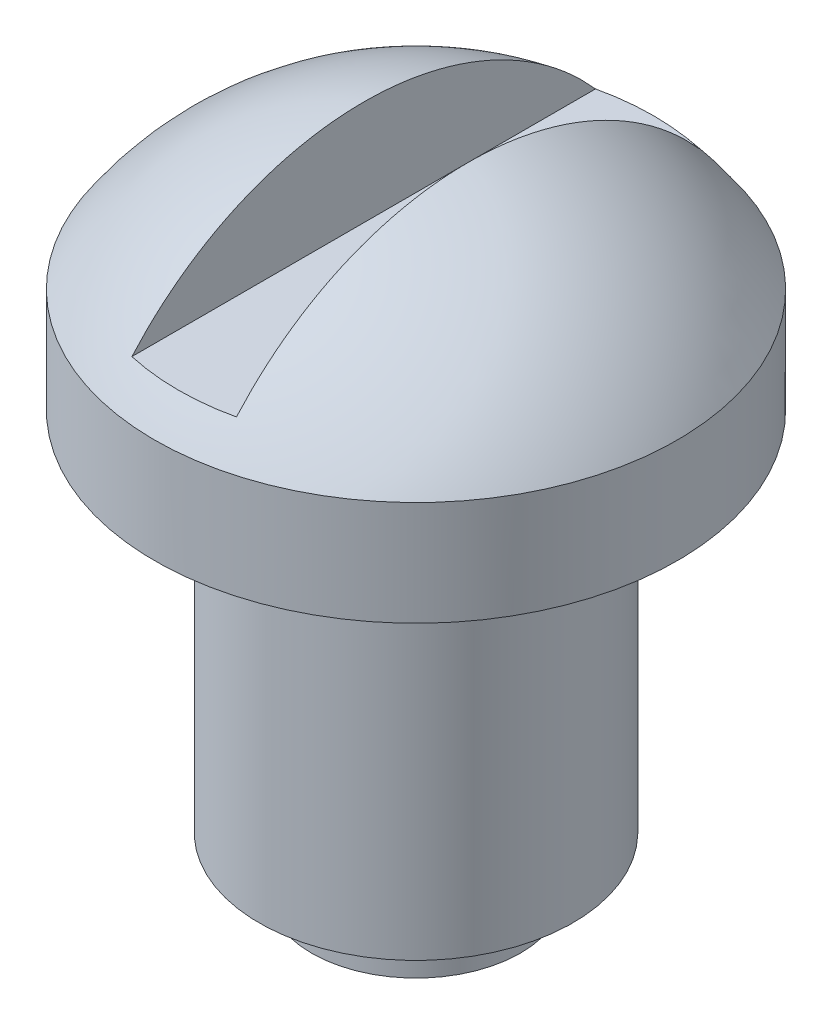
ISO-10303-21;
HEADER;
FILE_DESCRIPTION(('STEP AP214'),'2;1');
FILE_NAME('part.step','',(''),(''),'','','');
FILE_SCHEMA(('AUTOMOTIVE_DESIGN { 1 0 10303 214 1 1 1 1 }'));
ENDSEC;
DATA;
#1=APPLICATION_CONTEXT('core data for automotive mechanical design processes');
#2=APPLICATION_PROTOCOL_DEFINITION('international standard','automotive_design',2000,#1);
#3=PRODUCT_CONTEXT('',#1,'mechanical');
#4=PRODUCT('Part','Part','',(#3));
#5=PRODUCT_RELATED_PRODUCT_CATEGORY('part','',(#4));
#6=PRODUCT_DEFINITION_FORMATION('','',#4);
#7=PRODUCT_DEFINITION_CONTEXT('part definition',#1,'design');
#8=PRODUCT_DEFINITION('design','',#6,#7);
#9=PRODUCT_DEFINITION_SHAPE('','',#8);
#10=(LENGTH_UNIT() NAMED_UNIT(*) SI_UNIT(.MILLI.,.METRE.));
#11=(NAMED_UNIT(*) PLANE_ANGLE_UNIT() SI_UNIT($,.RADIAN.));
#12=(NAMED_UNIT(*) SI_UNIT($,.STERADIAN.) SOLID_ANGLE_UNIT());
#13=UNCERTAINTY_MEASURE_WITH_UNIT(LENGTH_MEASURE(1.E-05),#10,'distance_accuracy_value','');
#14=(GEOMETRIC_REPRESENTATION_CONTEXT(3) GLOBAL_UNCERTAINTY_ASSIGNED_CONTEXT((#13)) GLOBAL_UNIT_ASSIGNED_CONTEXT((#10,
#11,#12)) REPRESENTATION_CONTEXT('',''));
#15=CARTESIAN_POINT('',(0.,0.,0.));
#16=DIRECTION('',(0.,0.,1.));
#17=DIRECTION('',(1.,0.,0.));
#18=AXIS2_PLACEMENT_3D('',#15,#16,#17);
#19=CARTESIAN_POINT('',(0.,0.,0.));
#20=DIRECTION('',(0.,-1.,0.));
#21=DIRECTION('',(0.,0.,-0.999999999999978));
#22=AXIS2_PLACEMENT_3D('',#19,#20,#21);
#23=PLANE('',#22);
#24=CARTESIAN_POINT('',(0.,0.,0.));
#25=DIRECTION('',(0.,-1.,0.));
#26=DIRECTION('',(0.,0.,-0.999999999999978));
#27=AXIS2_PLACEMENT_3D('',#24,#25,#26);
#28=CIRCLE('',#27,2.);
#29=CARTESIAN_POINT('',(0.,0.,-1.99999999999996));
#30=VERTEX_POINT('',#29);
#31=EDGE_CURVE('E72',#30,#30,#28,.T.);
#32=ORIENTED_EDGE('',*,*,#31,.T.);
#33=EDGE_LOOP('',(#32));
#34=FACE_BOUND('',#33,.T.);
#35=ADVANCED_FACE('F42',(#34),#23,.T.);
#36=CARTESIAN_POINT('',(1.11022302462516E-13,8.00000000000001,0.));
#37=DIRECTION('',(0.,-1.,0.));
#38=DIRECTION('',(0.,0.,-0.999999999999978));
#39=AXIS2_PLACEMENT_3D('',#36,#37,#38);
#40=CYLINDRICAL_SURFACE('',#39,2.);
#41=CARTESIAN_POINT('',(0.,1.,0.));
#42=DIRECTION('',(0.,-1.,0.));
#43=DIRECTION('',(0.,0.,-0.999999999999978));
#44=AXIS2_PLACEMENT_3D('',#41,#42,#43);
#45=CIRCLE('',#44,2.);
#46=CARTESIAN_POINT('',(0.,1.,-1.99999999999998));
#47=VERTEX_POINT('',#46);
#48=EDGE_CURVE('E90',#47,#47,#45,.T.);
#49=ORIENTED_EDGE('',*,*,#48,.T.);
#50=EDGE_LOOP('',(#49));
#51=FACE_BOUND('',#50,.T.);
#52=ORIENTED_EDGE('',*,*,#31,.F.);
#53=EDGE_LOOP('',(#52));
#54=FACE_BOUND('',#53,.T.);
#55=ADVANCED_FACE('F124',(#51,#54),#40,.T.);
#56=CARTESIAN_POINT('',(0.,1.,0.));
#57=DIRECTION('',(0.,-1.,0.));
#58=DIRECTION('',(0.,0.,-0.999999999999978));
#59=AXIS2_PLACEMENT_3D('',#56,#57,#58);
#60=PLANE('',#59);
#61=CARTESIAN_POINT('',(0.,1.,0.));
#62=DIRECTION('',(0.,-1.,0.));
#63=DIRECTION('',(0.,0.,-0.999999999999978));
#64=AXIS2_PLACEMENT_3D('',#61,#62,#63);
#65=CIRCLE('',#64,3.);
#66=CARTESIAN_POINT('',(0.,1.,-2.99999999999995));
#67=VERTEX_POINT('',#66);
#68=EDGE_CURVE('E94',#67,#67,#65,.T.);
#69=ORIENTED_EDGE('',*,*,#68,.T.);
#70=EDGE_LOOP('',(#69));
#71=FACE_BOUND('',#70,.T.);
#72=ORIENTED_EDGE('',*,*,#48,.F.);
#73=EDGE_LOOP('',(#72));
#74=FACE_BOUND('',#73,.T.);
#75=ADVANCED_FACE('F129',(#71,#74),#60,.T.);
#76=CARTESIAN_POINT('',(1.11022302462516E-13,8.00000000000001,0.));
#77=DIRECTION('',(0.,-1.,0.));
#78=DIRECTION('',(0.,0.,-0.999999999999978));
#79=AXIS2_PLACEMENT_3D('',#76,#77,#78);
#80=CYLINDRICAL_SURFACE('',#79,3.);
#81=CARTESIAN_POINT('',(1.11022302462516E-13,8.00000000000001,0.));
#82=DIRECTION('',(0.,-1.,0.));
#83=DIRECTION('',(0.,0.,-0.999999999999978));
#84=AXIS2_PLACEMENT_3D('',#81,#82,#83);
#85=CIRCLE('',#84,3.);
#86=CARTESIAN_POINT('',(1.11022302462516E-13,8.00000000000001,-2.99999999999993));
#87=VERTEX_POINT('',#86);
#88=EDGE_CURVE('E98',#87,#87,#85,.T.);
#89=ORIENTED_EDGE('',*,*,#88,.T.);
#90=EDGE_LOOP('',(#89));
#91=FACE_BOUND('',#90,.T.);
#92=ORIENTED_EDGE('',*,*,#68,.F.);
#93=EDGE_LOOP('',(#92));
#94=FACE_BOUND('',#93,.T.);
#95=ADVANCED_FACE('F136',(#91,#94),#80,.T.);
#96=CARTESIAN_POINT('',(1.11022302462516E-13,8.00000000000001,0.));
#97=DIRECTION('',(0.,-1.,0.));
#98=DIRECTION('',(0.,0.,-0.999999999999978));
#99=AXIS2_PLACEMENT_3D('',#96,#97,#98);
#100=PLANE('',#99);
#101=CARTESIAN_POINT('',(1.11022302462516E-13,8.00000000000001,0.));
#102=DIRECTION('',(0.,-1.,0.));
#103=DIRECTION('',(0.,0.,-0.999999999999978));
#104=AXIS2_PLACEMENT_3D('',#101,#102,#103);
#105=CIRCLE('',#104,5.);
#106=CARTESIAN_POINT('',(1.11022302462516E-13,8.00000000000001,-4.99999999999989));
#107=VERTEX_POINT('',#106);
#108=EDGE_CURVE('E102',#107,#107,#105,.T.);
#109=ORIENTED_EDGE('',*,*,#108,.T.);
#110=EDGE_LOOP('',(#109));
#111=FACE_BOUND('',#110,.T.);
#112=ORIENTED_EDGE('',*,*,#88,.F.);
#113=EDGE_LOOP('',(#112));
#114=FACE_BOUND('',#113,.T.);
#115=ADVANCED_FACE('F142',(#111,#114),#100,.T.);
#116=CARTESIAN_POINT('',(1.11022302462516E-13,8.00000000000001,0.));
#117=DIRECTION('',(0.,-1.,0.));
#118=DIRECTION('',(0.,0.,-0.999999999999978));
#119=AXIS2_PLACEMENT_3D('',#116,#117,#118);
#120=CYLINDRICAL_SURFACE('',#119,5.);
#121=CARTESIAN_POINT('',(1.11022302462516E-13,10.,0.));
#122=DIRECTION('',(0.,-1.,0.));
#123=DIRECTION('',(0.,0.,-0.999999999999978));
#124=AXIS2_PLACEMENT_3D('',#121,#122,#123);
#125=CIRCLE('',#124,5.);
#126=CARTESIAN_POINT('',(1.11022302462516E-13,10.,-4.99999999999989));
#127=VERTEX_POINT('',#126);
#128=EDGE_CURVE('E106',#127,#127,#125,.T.);
#129=ORIENTED_EDGE('',*,*,#128,.T.);
#130=EDGE_LOOP('',(#129));
#131=FACE_BOUND('',#130,.T.);
#132=ORIENTED_EDGE('',*,*,#108,.F.);
#133=EDGE_LOOP('',(#132));
#134=FACE_BOUND('',#133,.T.);
#135=ADVANCED_FACE('F121',(#131,#134),#120,.T.);
#136=CARTESIAN_POINT('',(1.11022302462516E-13,6.6833752096446,0.));
#137=DIRECTION('',(0.,-1.,0.));
#138=DIRECTION('',(0.999999999999978,0.,0.));
#139=AXIS2_PLACEMENT_3D('',#136,#137,#138);
#140=SPHERICAL_SURFACE('',#139,6.);
#141=CARTESIAN_POINT('',(1.00000000000011,6.6833752096446,0.));
#142=DIRECTION('',(0.999999999999978,0.,0.));
#143=DIRECTION('',(0.,0.,-0.999999999999978));
#144=AXIS2_PLACEMENT_3D('',#141,#142,#143);
#145=CIRCLE('',#144,5.91607978309962);
#146=CARTESIAN_POINT('',(1.00000000000011,10.5994549927442,4.43444688009649));
#147=VERTEX_POINT('',#146);
#148=CARTESIAN_POINT('',(1.00000000000011,10.5994549927442,-4.4344468800966));
#149=VERTEX_POINT('',#148);
#150=EDGE_CURVE('E11',#147,#149,#145,.F.);
#151=ORIENTED_EDGE('',*,*,#150,.F.);
#152=CARTESIAN_POINT('',(1.11022302462516E-13,10.5994549927442,0.));
#153=DIRECTION('',(0.,1.,0.));
#154=DIRECTION('',(0.,0.,0.999999999999978));
#155=AXIS2_PLACEMENT_3D('',#152,#153,#154);
#156=CIRCLE('',#155,4.54580236398355);
#157=CARTESIAN_POINT('',(-0.99999999999989,10.5994549927442,4.43444688009649));
#158=VERTEX_POINT('',#157);
#159=EDGE_CURVE('E71',#147,#158,#156,.F.);
#160=ORIENTED_EDGE('',*,*,#159,.T.);
#161=CARTESIAN_POINT('',(-0.99999999999989,6.6833752096446,0.));
#162=DIRECTION('',(0.999999999999978,0.,0.));
#163=DIRECTION('',(0.,0.,-0.999999999999978));
#164=AXIS2_PLACEMENT_3D('',#161,#162,#163);
#165=CIRCLE('',#164,5.91607978309962);
#166=CARTESIAN_POINT('',(-0.99999999999989,10.5994549927442,-4.4344468800966));
#167=VERTEX_POINT('',#166);
#168=EDGE_CURVE('E68',#158,#167,#165,.F.);
#169=ORIENTED_EDGE('',*,*,#168,.T.);
#170=EDGE_CURVE('E50',#167,#149,#156,.F.);
#171=ORIENTED_EDGE('',*,*,#170,.T.);
#172=EDGE_LOOP('',(#151,#160,#169,#171));
#173=FACE_BOUND('',#172,.T.);
#174=ORIENTED_EDGE('',*,*,#128,.F.);
#175=EDGE_LOOP('',(#174));
#176=FACE_BOUND('',#175,.T.);
#177=ADVANCED_FACE('F81',(#173,#176),#140,.T.);
#178=CARTESIAN_POINT('',(1.,0.,-4.99999999999989));
#179=DIRECTION('',(0.999999999999978,0.,0.));
#180=DIRECTION('',(0.,0.,-0.999999999999978));
#181=AXIS2_PLACEMENT_3D('',#178,#179,#180);
#182=PLANE('',#181);
#183=DIRECTION('',(0.,0.,0.999999999999978));
#184=VECTOR('',#183,1.);
#185=CARTESIAN_POINT('',(1.00000000000011,10.5994549927442,-4.99999999999983));
#186=LINE('',#185,#184);
#187=EDGE_CURVE('E79',#149,#147,#186,.T.);
#188=ORIENTED_EDGE('',*,*,#187,.T.);
#189=ORIENTED_EDGE('',*,*,#150,.T.);
#190=EDGE_LOOP('',(#188,#189));
#191=FACE_BOUND('',#190,.T.);
#192=ADVANCED_FACE('F113',(#191),#182,.F.);
#193=CARTESIAN_POINT('',(1.11022302462516E-13,10.5994549927442,-4.99999999999983));
#194=DIRECTION('',(0.,1.,0.));
#195=DIRECTION('',(0.,0.,0.999999999999978));
#196=AXIS2_PLACEMENT_3D('',#193,#194,#195);
#197=PLANE('',#196);
#198=DIRECTION('',(0.,0.,0.999999999999978));
#199=VECTOR('',#198,1.);
#200=CARTESIAN_POINT('',(-0.99999999999989,10.5994549927442,-4.99999999999983));
#201=LINE('',#200,#199);
#202=EDGE_CURVE('E56',#167,#158,#201,.T.);
#203=ORIENTED_EDGE('',*,*,#202,.T.);
#204=ORIENTED_EDGE('',*,*,#159,.F.);
#205=ORIENTED_EDGE('',*,*,#187,.F.);
#206=ORIENTED_EDGE('',*,*,#170,.F.);
#207=EDGE_LOOP('',(#203,#204,#205,#206));
#208=FACE_BOUND('',#207,.T.);
#209=ADVANCED_FACE('F75',(#208),#197,.T.);
#210=CARTESIAN_POINT('',(-1.,0.,-4.99999999999989));
#211=DIRECTION('',(0.999999999999978,0.,0.));
#212=DIRECTION('',(0.,0.,-0.999999999999978));
#213=AXIS2_PLACEMENT_3D('',#210,#211,#212);
#214=PLANE('',#213);
#215=ORIENTED_EDGE('',*,*,#202,.F.);
#216=ORIENTED_EDGE('',*,*,#168,.F.);
#217=EDGE_LOOP('',(#215,#216));
#218=FACE_BOUND('',#217,.T.);
#219=ADVANCED_FACE('F69',(#218),#214,.T.);
#220=CLOSED_SHELL('',(#35,#55,#75,#95,#115,#135,#177,#192,#209,#219));
#221=MANIFOLD_SOLID_BREP('B2',#220);
#222=ADVANCED_BREP_SHAPE_REPRESENTATION('',(#18,#221),#14);
#223=SHAPE_DEFINITION_REPRESENTATION(#9,#222);
ENDSEC;
END-ISO-10303-21;
